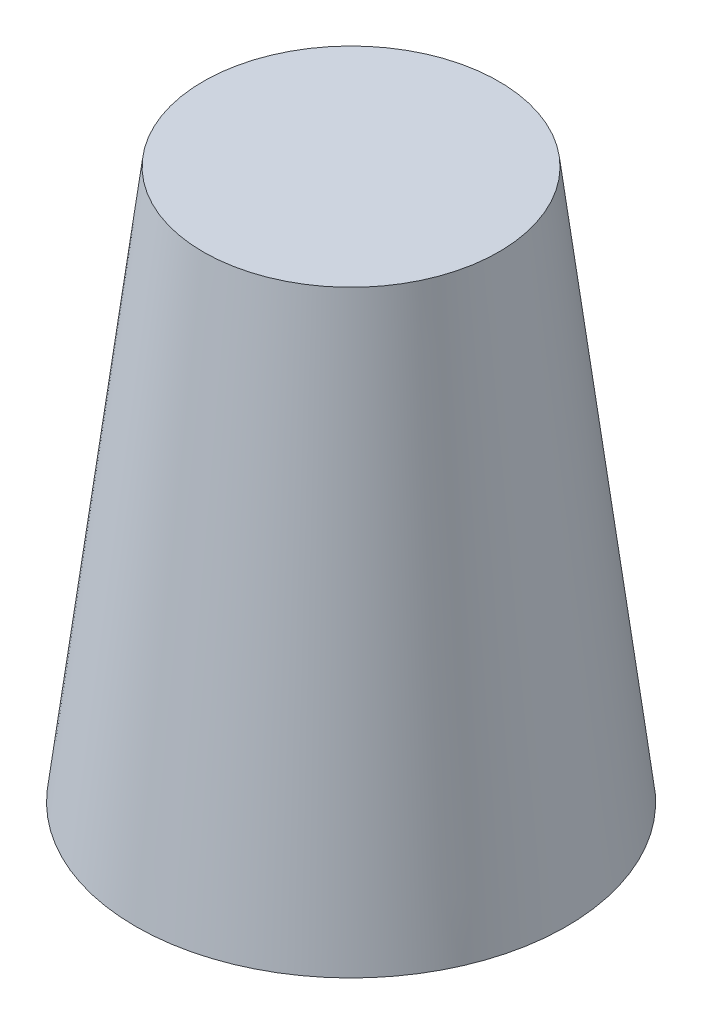
ISO-10303-21;
HEADER;
FILE_DESCRIPTION(('STEP AP214'),'2;1');
FILE_NAME('part.step','',(''),(''),'','','');
FILE_SCHEMA(('AUTOMOTIVE_DESIGN { 1 0 10303 214 1 1 1 1 }'));
ENDSEC;
DATA;
#1=APPLICATION_CONTEXT('core data for automotive mechanical design processes');
#2=APPLICATION_PROTOCOL_DEFINITION('international standard','automotive_design',2000,#1);
#3=PRODUCT_CONTEXT('',#1,'mechanical');
#4=PRODUCT('Part','Part','',(#3));
#5=PRODUCT_RELATED_PRODUCT_CATEGORY('part','',(#4));
#6=PRODUCT_DEFINITION_FORMATION('','',#4);
#7=PRODUCT_DEFINITION_CONTEXT('part definition',#1,'design');
#8=PRODUCT_DEFINITION('design','',#6,#7);
#9=PRODUCT_DEFINITION_SHAPE('','',#8);
#10=(LENGTH_UNIT() NAMED_UNIT(*) SI_UNIT(.MILLI.,.METRE.));
#11=(NAMED_UNIT(*) PLANE_ANGLE_UNIT() SI_UNIT($,.RADIAN.));
#12=(NAMED_UNIT(*) SI_UNIT($,.STERADIAN.) SOLID_ANGLE_UNIT());
#13=UNCERTAINTY_MEASURE_WITH_UNIT(LENGTH_MEASURE(1.E-05),#10,'distance_accuracy_value','');
#14=(GEOMETRIC_REPRESENTATION_CONTEXT(3) GLOBAL_UNCERTAINTY_ASSIGNED_CONTEXT((#13)) GLOBAL_UNIT_ASSIGNED_CONTEXT((#10,
#11,#12)) REPRESENTATION_CONTEXT('',''));
#15=CARTESIAN_POINT('',(0.,0.,0.));
#16=DIRECTION('',(0.,0.,1.));
#17=DIRECTION('',(1.,0.,0.));
#18=AXIS2_PLACEMENT_3D('',#15,#16,#17);
#19=CARTESIAN_POINT('',(0.,0.,0.));
#20=DIRECTION('',(0.,-1.,0.));
#21=DIRECTION('',(0.,0.,1.));
#22=AXIS2_PLACEMENT_3D('',#19,#20,#21);
#23=CONICAL_SURFACE('',#22,90.,0.122173047639604);
#24=CARTESIAN_POINT('',(0.,230.,0.));
#25=DIRECTION('',(0.,1.,0.));
#26=DIRECTION('',(0.,0.,1.));
#27=AXIS2_PLACEMENT_3D('',#24,#25,#26);
#28=CIRCLE('',#27,61.7595509923318);
#29=CARTESIAN_POINT('',(0.,230.,61.7595509923318));
#30=VERTEX_POINT('',#29);
#31=EDGE_CURVE('E12',#30,#30,#28,.T.);
#32=ORIENTED_EDGE('',*,*,#31,.F.);
#33=EDGE_LOOP('',(#32));
#34=FACE_BOUND('',#33,.T.);
#35=CARTESIAN_POINT('',(0.,0.,0.));
#36=DIRECTION('',(0.,1.,0.));
#37=DIRECTION('',(0.,0.,1.));
#38=AXIS2_PLACEMENT_3D('',#35,#36,#37);
#39=CIRCLE('',#38,90.);
#40=CARTESIAN_POINT('',(0.,0.,90.));
#41=VERTEX_POINT('',#40);
#42=EDGE_CURVE('E49',#41,#41,#39,.T.);
#43=ORIENTED_EDGE('',*,*,#42,.T.);
#44=EDGE_LOOP('',(#43));
#45=FACE_BOUND('',#44,.T.);
#46=ADVANCED_FACE('F43',(#34,#45),#23,.T.);
#47=CARTESIAN_POINT('',(0.,230.,0.));
#48=DIRECTION('',(0.,1.,0.));
#49=DIRECTION('',(0.,0.,1.));
#50=AXIS2_PLACEMENT_3D('',#47,#48,#49);
#51=PLANE('',#50);
#52=ORIENTED_EDGE('',*,*,#31,.T.);
#53=EDGE_LOOP('',(#52));
#54=FACE_BOUND('',#53,.T.);
#55=ADVANCED_FACE('F68',(#54),#51,.T.);
#56=CARTESIAN_POINT('',(0.,0.,0.));
#57=DIRECTION('',(0.,1.,0.));
#58=DIRECTION('',(0.,0.,1.));
#59=AXIS2_PLACEMENT_3D('',#56,#57,#58);
#60=PLANE('',#59);
#61=CARTESIAN_POINT('',(0.,0.,0.));
#62=DIRECTION('',(0.,-1.,0.));
#63=DIRECTION('',(0.,0.,-1.));
#64=AXIS2_PLACEMENT_3D('',#61,#62,#63);
#65=CIRCLE('',#64,85.);
#66=CARTESIAN_POINT('',(0.,0.,-85.));
#67=VERTEX_POINT('',#66);
#68=EDGE_CURVE('E57',#67,#67,#65,.T.);
#69=ORIENTED_EDGE('',*,*,#68,.F.);
#70=EDGE_LOOP('',(#69));
#71=FACE_BOUND('',#70,.T.);
#72=ORIENTED_EDGE('',*,*,#42,.F.);
#73=EDGE_LOOP('',(#72));
#74=FACE_BOUND('',#73,.T.);
#75=ADVANCED_FACE('F65',(#71,#74),#60,.F.);
#76=CARTESIAN_POINT('',(0.,0.,0.));
#77=DIRECTION('',(0.,-1.,0.));
#78=DIRECTION('',(0.,0.,-1.));
#79=AXIS2_PLACEMENT_3D('',#76,#77,#78);
#80=CONICAL_SURFACE('',#79,85.,0.122173047639604);
#81=CARTESIAN_POINT('',(0.,220.,0.));
#82=DIRECTION('',(0.,-1.,0.));
#83=DIRECTION('',(0.,0.,-1.));
#84=AXIS2_PLACEMENT_3D('',#81,#82,#83);
#85=CIRCLE('',#84,57.9873966013608);
#86=CARTESIAN_POINT('',(0.,220.,-57.9873966013608));
#87=VERTEX_POINT('',#86);
#88=EDGE_CURVE('E53',#87,#87,#85,.T.);
#89=ORIENTED_EDGE('',*,*,#88,.F.);
#90=EDGE_LOOP('',(#89));
#91=FACE_BOUND('',#90,.T.);
#92=ORIENTED_EDGE('',*,*,#68,.T.);
#93=EDGE_LOOP('',(#92));
#94=FACE_BOUND('',#93,.T.);
#95=ADVANCED_FACE('F63',(#91,#94),#80,.F.);
#96=CARTESIAN_POINT('',(0.,220.,0.));
#97=DIRECTION('',(0.,-1.,0.));
#98=DIRECTION('',(0.,0.,-1.));
#99=AXIS2_PLACEMENT_3D('',#96,#97,#98);
#100=PLANE('',#99);
#101=ORIENTED_EDGE('',*,*,#88,.T.);
#102=EDGE_LOOP('',(#101));
#103=FACE_BOUND('',#102,.T.);
#104=ADVANCED_FACE('F73',(#103),#100,.T.);
#105=CLOSED_SHELL('',(#46,#55,#75,#95,#104));
#106=MANIFOLD_SOLID_BREP('B2',#105);
#107=ADVANCED_BREP_SHAPE_REPRESENTATION('',(#18,#106),#14);
#108=SHAPE_DEFINITION_REPRESENTATION(#9,#107);
ENDSEC;
END-ISO-10303-21;
